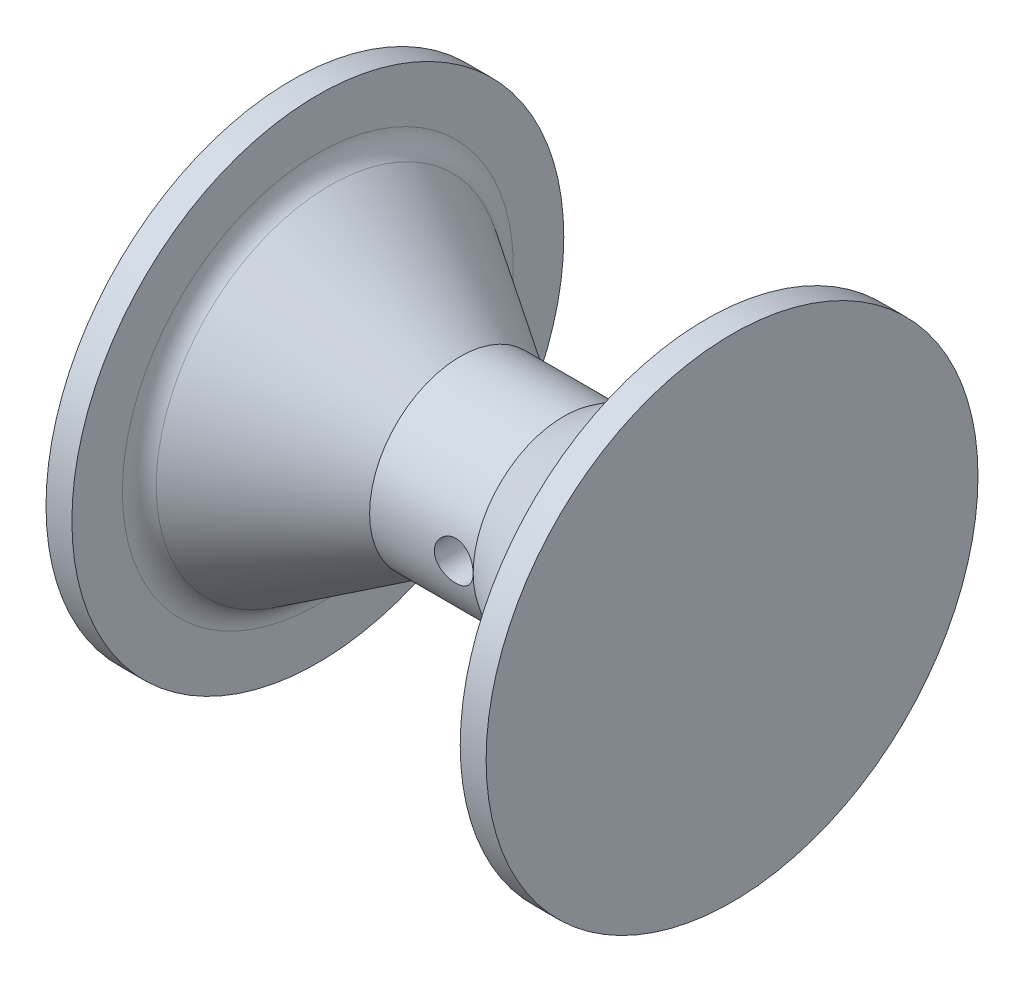
ISO-10303-21;
HEADER;
FILE_DESCRIPTION(('STEP AP214'),'2;1');
FILE_NAME('part.step','',(''),(''),'','','');
FILE_SCHEMA(('AUTOMOTIVE_DESIGN { 1 0 10303 214 1 1 1 1 }'));
ENDSEC;
DATA;
#1=APPLICATION_CONTEXT('core data for automotive mechanical design processes');
#2=APPLICATION_PROTOCOL_DEFINITION('international standard','automotive_design',2000,#1);
#3=PRODUCT_CONTEXT('',#1,'mechanical');
#4=PRODUCT('Part','Part','',(#3));
#5=PRODUCT_RELATED_PRODUCT_CATEGORY('part','',(#4));
#6=PRODUCT_DEFINITION_FORMATION('','',#4);
#7=PRODUCT_DEFINITION_CONTEXT('part definition',#1,'design');
#8=PRODUCT_DEFINITION('design','',#6,#7);
#9=PRODUCT_DEFINITION_SHAPE('','',#8);
#10=(LENGTH_UNIT() NAMED_UNIT(*) SI_UNIT(.MILLI.,.METRE.));
#11=(NAMED_UNIT(*) PLANE_ANGLE_UNIT() SI_UNIT($,.RADIAN.));
#12=(NAMED_UNIT(*) SI_UNIT($,.STERADIAN.) SOLID_ANGLE_UNIT());
#13=UNCERTAINTY_MEASURE_WITH_UNIT(LENGTH_MEASURE(1.E-05),#10,'distance_accuracy_value','');
#14=(GEOMETRIC_REPRESENTATION_CONTEXT(3) GLOBAL_UNCERTAINTY_ASSIGNED_CONTEXT((#13)) GLOBAL_UNIT_ASSIGNED_CONTEXT((#10,
#11,#12)) REPRESENTATION_CONTEXT('',''));
#15=CARTESIAN_POINT('',(0.,0.,0.));
#16=DIRECTION('',(0.,0.,1.));
#17=DIRECTION('',(1.,0.,0.));
#18=AXIS2_PLACEMENT_3D('',#15,#16,#17);
#19=CARTESIAN_POINT('',(-4.,0.,0.));
#20=DIRECTION('',(-1.,0.,0.));
#21=DIRECTION('',(0.,0.,1.));
#22=AXIS2_PLACEMENT_3D('',#19,#20,#21);
#23=CONICAL_SURFACE('',#22,7.,0.566729217523506);
#24=CARTESIAN_POINT('',(-14.0737509843863,0.,0.));
#25=DIRECTION('',(-1.,0.,0.));
#26=DIRECTION('',(0.,0.,1.));
#27=AXIS2_PLACEMENT_3D('',#24,#25,#26);
#28=CIRCLE('',#27,13.4105688082458);
#29=CARTESIAN_POINT('',(-14.0737509843863,0.,13.4105688082458));
#30=VERTEX_POINT('',#29);
#31=EDGE_CURVE('E133',#30,#30,#28,.F.);
#32=ORIENTED_EDGE('',*,*,#31,.T.);
#33=EDGE_LOOP('',(#32));
#34=FACE_BOUND('',#33,.T.);
#35=CARTESIAN_POINT('',(-4.,0.,0.));
#36=DIRECTION('',(-1.,0.,0.));
#37=DIRECTION('',(0.,0.,1.));
#38=AXIS2_PLACEMENT_3D('',#35,#36,#37);
#39=CIRCLE('',#38,7.);
#40=CARTESIAN_POINT('',(-4.,0.,7.));
#41=VERTEX_POINT('',#40);
#42=EDGE_CURVE('E125',#41,#41,#39,.T.);
#43=ORIENTED_EDGE('',*,*,#42,.T.);
#44=EDGE_LOOP('',(#43));
#45=FACE_BOUND('',#44,.T.);
#46=ADVANCED_FACE('F39',(#34,#45),#23,.T.);
#47=CARTESIAN_POINT('',(0.,0.,0.));
#48=DIRECTION('',(-1.,0.,0.));
#49=DIRECTION('',(0.,0.,1.));
#50=AXIS2_PLACEMENT_3D('',#47,#48,#49);
#51=CYLINDRICAL_SURFACE('',#50,7.);
#52=ORIENTED_EDGE('',*,*,#42,.F.);
#53=EDGE_LOOP('',(#52));
#54=FACE_BOUND('',#53,.T.);
#55=CARTESIAN_POINT('',(4.,0.,0.));
#56=DIRECTION('',(-1.,0.,0.));
#57=DIRECTION('',(0.,0.,1.));
#58=AXIS2_PLACEMENT_3D('',#55,#56,#57);
#59=CIRCLE('',#58,7.);
#60=CARTESIAN_POINT('',(4.,0.,-7.));
#61=VERTEX_POINT('',#60);
#62=CARTESIAN_POINT('',(4.,0.,7.));
#63=VERTEX_POINT('',#62);
#64=EDGE_CURVE('E120',#61,#63,#59,.T.);
#65=ORIENTED_EDGE('',*,*,#64,.T.);
#66=CARTESIAN_POINT('',(4.,0.,7.));
#67=CARTESIAN_POINT('',(3.9999971004257,-0.0832358860906166,6.99999846043226));
#68=CARTESIAN_POINT('',(3.99304839161214,-0.166507195600275,6.9985002594971));
#69=CARTESIAN_POINT('',(3.96546434314641,-0.330687344293327,6.99266829827728));
#70=CARTESIAN_POINT('',(3.94481895580507,-0.41159440357119,6.98833245637099));
#71=CARTESIAN_POINT('',(3.89051563539196,-0.568649323817737,6.97730831788827));
#72=CARTESIAN_POINT('',(3.85687102061868,-0.644801963446555,6.97062242967171));
#73=CARTESIAN_POINT('',(3.77756591382874,-0.790378177960787,6.95562106817971));
#74=CARTESIAN_POINT('',(3.73190583075006,-0.859801981747369,6.94730565036661));
#75=CARTESIAN_POINT('',(3.62911970032649,-0.99102479053523,6.92981369246311));
#76=CARTESIAN_POINT('',(3.57184377810147,-1.05270503419445,6.92062683143259));
#77=CARTESIAN_POINT('',(3.4477736843148,-1.16566042389435,6.90250069814144));
#78=CARTESIAN_POINT('',(3.38097869174874,-1.21693467150908,6.8935614473163));
#79=CARTESIAN_POINT('',(3.23889424713957,-1.30814204379809,6.87684116047225));
#80=CARTESIAN_POINT('',(3.16352248224379,-1.34794958335009,6.8690733634436));
#81=CARTESIAN_POINT('',(3.00696554623316,-1.41428823691148,6.85572325558537));
#82=CARTESIAN_POINT('',(2.92578104150743,-1.44082087001716,6.85014069470711));
#83=CARTESIAN_POINT('',(2.76118891341193,-1.47946574422454,6.84189808926311));
#84=CARTESIAN_POINT('',(2.67783272433614,-1.49178779748342,6.83919556896486));
#85=CARTESIAN_POINT('',(2.51019576749301,-1.50231395206577,6.83689139845106));
#86=CARTESIAN_POINT('',(2.42591510982005,-1.50051971664629,6.83728938291729));
#87=CARTESIAN_POINT('',(2.26037531206621,-1.48303326340861,6.84110276603832));
#88=CARTESIAN_POINT('',(2.17908911089985,-1.46758398649408,6.84446541682162));
#89=CARTESIAN_POINT('',(2.02028975971066,-1.42361054298677,6.85374593375788));
#90=CARTESIAN_POINT('',(1.94277681396768,-1.39508566936466,6.85966393808402));
#91=CARTESIAN_POINT('',(1.79303712712666,-1.32554551075991,6.87344080755724));
#92=CARTESIAN_POINT('',(1.72085548728745,-1.2844361097283,6.88131420983365));
#93=CARTESIAN_POINT('',(1.58432483504204,-1.19096007283993,6.89810572501288));
#94=CARTESIAN_POINT('',(1.5199768513138,-1.13859196103562,6.90702397481896));
#95=CARTESIAN_POINT('',(1.3995406443266,-1.0227954275532,6.92512718393878));
#96=CARTESIAN_POINT('',(1.34365129341526,-0.95916023396441,6.93431383972178));
#97=CARTESIAN_POINT('',(1.24330626631034,-0.823317306269096,6.95175017497059));
#98=CARTESIAN_POINT('',(1.19885078139961,-0.7511094287754,6.95999983875972));
#99=CARTESIAN_POINT('',(1.12258932009307,-0.599933462049959,6.97465778534003));
#100=CARTESIAN_POINT('',(1.09080858742202,-0.520952258863483,6.98106238643354));
#101=CARTESIAN_POINT('',(1.04102435167891,-0.358603146685707,6.99128109245334));
#102=CARTESIAN_POINT('',(1.02301892743668,-0.275235851133669,6.99509555860384));
#103=CARTESIAN_POINT('',(1.00158378585658,-0.108187670836629,6.99965306347808));
#104=CARTESIAN_POINT('',(0.99788228711822,-0.0245431772716144,7.00045336521066));
#105=CARTESIAN_POINT('',(1.00442457112516,0.142168973650405,6.99905248935969));
#106=CARTESIAN_POINT('',(1.01466744796294,0.225236668127255,6.99685150675698));
#107=CARTESIAN_POINT('',(1.0485822436617,0.387542537982806,6.98973143045266));
#108=CARTESIAN_POINT('',(1.07211236947253,0.466811712908477,6.9848410504546));
#109=CARTESIAN_POINT('',(1.13177694299482,0.620278450473418,6.9728892442151));
#110=CARTESIAN_POINT('',(1.16791243431165,0.69447559258774,6.96582763822237));
#111=CARTESIAN_POINT('',(1.25233354306033,0.836821397964754,6.950175043904));
#112=CARTESIAN_POINT('',(1.30077979490973,0.90487257511114,6.94156431354275));
#113=CARTESIAN_POINT('',(1.40823482488874,1.0319769255236,6.92381033034847));
#114=CARTESIAN_POINT('',(1.46724491588744,1.091028978692,6.91466701142097));
#115=CARTESIAN_POINT('',(1.59539737018714,1.19952711057989,6.89668172706324));
#116=CARTESIAN_POINT('',(1.6647000992221,1.24878537255157,6.88784792221285));
#117=CARTESIAN_POINT('',(1.81075459647799,1.3349641538604,6.87166654559681));
#118=CARTESIAN_POINT('',(1.88750604697749,1.37188519913706,6.86431891048055));
#119=CARTESIAN_POINT('',(2.0458722989946,1.43209741248548,6.8520100980739));
#120=CARTESIAN_POINT('',(2.12745735643067,1.45546398641275,6.84703574582967));
#121=CARTESIAN_POINT('',(2.29351558383364,1.48812696085335,6.84001186708418));
#122=CARTESIAN_POINT('',(2.37798831120132,1.49742550780258,6.83796189439706));
#123=CARTESIAN_POINT('',(2.54553234317524,1.5015999992604,6.83704618848155));
#124=CARTESIAN_POINT('',(2.62859601498058,1.49677347258311,6.83811476518543));
#125=CARTESIAN_POINT('',(2.79269724213259,1.47349789406331,6.8431676318483));
#126=CARTESIAN_POINT('',(2.87373481938657,1.45504898957979,6.84715189026714));
#127=CARTESIAN_POINT('',(3.03125865786917,1.40519345940434,6.85755581104157));
#128=CARTESIAN_POINT('',(3.10775864866429,1.37382847170887,6.86396764224703));
#129=CARTESIAN_POINT('',(3.25445537250685,1.29906751595601,6.87850764590649));
#130=CARTESIAN_POINT('',(3.32465147861504,1.255670353015,6.88663598880363));
#131=CARTESIAN_POINT('',(3.45821819372537,1.15708290349304,6.90389055593232));
#132=CARTESIAN_POINT('',(3.52142969594698,1.10167987421237,6.91303309938926));
#133=CARTESIAN_POINT('',(3.63775626252046,0.981086554619621,6.93117449799694));
#134=CARTESIAN_POINT('',(3.69086899431221,0.915894009385597,6.94017331951296));
#135=CARTESIAN_POINT('',(3.78611595950556,0.776603147268717,6.95714491048987));
#136=CARTESIAN_POINT('',(3.82810660623098,0.702404846009642,6.96510364570626));
#137=CARTESIAN_POINT('',(3.89895452890618,0.547850160940599,6.97895826104019));
#138=CARTESIAN_POINT('',(3.92782302258504,0.46749910586388,6.98485590212343));
#139=CARTESIAN_POINT('',(3.96635218513115,0.322535217553204,6.99284848461772));
#140=CARTESIAN_POINT('',(3.97894643398003,0.258717205545979,6.99551391888263));
#141=CARTESIAN_POINT('',(3.99577130171167,0.129939960853846,6.99909024154719));
#142=CARTESIAN_POINT('',(4.00000226364606,0.0649807750887447,7.00000120191314));
#143=CARTESIAN_POINT('',(4.,0.,7.));
#144=B_SPLINE_CURVE_WITH_KNOTS('',3,(#66,#67,#68,#69,#70,#71,#72,#73,#74,#75,#76,#77,#78,#79,
#80,#81,#82,#83,#84,#85,#86,#87,#88,#89,#90,#91,#92,#93,#94,#95,#96,#97,#98,#99,#100,#101,#102,
#103,#104,#105,#106,#107,#108,#109,#110,#111,#112,#113,#114,#115,#116,#117,#118,#119,#120,#121,
#122,#123,#124,#125,#126,#127,#128,#129,#130,#131,#132,#133,#134,#135,#136,#137,#138,#139,#140,
#141,#142,#143),.UNSPECIFIED.,.T.,.F.,(4,2,2,2,2,2,2,2,2,2,2,2,2,2,2,2,2,2,2,2,2,2,2,2,2,2,2,2,
2,2,2,2,2,2,2,2,2,2,4),(0.,0.249469836512082,0.499122883219936,0.748520824425602,
0.997910278645886,1.25074961881732,1.50361077918506,1.7591442921451,2.0146485567749,
2.26633008124666,2.51798195169165,2.76524475452928,3.01252092904568,3.26169356165968,
3.51089887920889,3.76527011050291,4.0196455970235,4.27452521139806,4.52936927256343,
4.77934665704185,5.02930780231429,5.27665060589267,5.52401389198434,5.77478733867803,
6.02559197304485,6.28082063283534,6.53603841075806,6.78982240408475,7.04356767229185,
7.29200680540294,7.5404432510827,7.78808499706785,8.03575134451623,8.28822950154114,
8.54076590397115,8.79641910357222,9.05185334010271,9.24661799132294,9.44137465337336),.UNSPECIFIED.);
#145=EDGE_CURVE('E58',#63,#63,#144,.T.);
#146=ORIENTED_EDGE('',*,*,#145,.T.);
#147=EDGE_CURVE('E121',#63,#61,#59,.T.);
#148=ORIENTED_EDGE('',*,*,#147,.T.);
#149=CARTESIAN_POINT('',(4.,0.,-7.));
#150=CARTESIAN_POINT('',(3.9999971004257,0.0832358860906166,-6.99999846043226));
#151=CARTESIAN_POINT('',(3.99304839161214,0.166507195600275,-6.9985002594971));
#152=CARTESIAN_POINT('',(3.96546434314641,0.330687344293327,-6.99266829827728));
#153=CARTESIAN_POINT('',(3.94481895580507,0.41159440357119,-6.98833245637099));
#154=CARTESIAN_POINT('',(3.89051563539196,0.568649323817737,-6.97730831788827));
#155=CARTESIAN_POINT('',(3.85687102061868,0.644801963446555,-6.97062242967171));
#156=CARTESIAN_POINT('',(3.77756591382874,0.790378177960787,-6.95562106817971));
#157=CARTESIAN_POINT('',(3.73190583075006,0.859801981747369,-6.94730565036661));
#158=CARTESIAN_POINT('',(3.62911970032649,0.99102479053523,-6.92981369246311));
#159=CARTESIAN_POINT('',(3.57184377810147,1.05270503419445,-6.92062683143259));
#160=CARTESIAN_POINT('',(3.4477736843148,1.16566042389435,-6.90250069814144));
#161=CARTESIAN_POINT('',(3.38097869174874,1.21693467150908,-6.8935614473163));
#162=CARTESIAN_POINT('',(3.23889424713957,1.30814204379809,-6.87684116047225));
#163=CARTESIAN_POINT('',(3.16352248224379,1.34794958335009,-6.8690733634436));
#164=CARTESIAN_POINT('',(3.00696554623316,1.41428823691148,-6.85572325558537));
#165=CARTESIAN_POINT('',(2.92578104150743,1.44082087001716,-6.85014069470711));
#166=CARTESIAN_POINT('',(2.76118891341193,1.47946574422454,-6.84189808926311));
#167=CARTESIAN_POINT('',(2.67783272433614,1.49178779748342,-6.83919556896486));
#168=CARTESIAN_POINT('',(2.51019576749301,1.50231395206577,-6.83689139845106));
#169=CARTESIAN_POINT('',(2.42591510982005,1.50051971664629,-6.83728938291729));
#170=CARTESIAN_POINT('',(2.26037531206621,1.48303326340861,-6.84110276603832));
#171=CARTESIAN_POINT('',(2.17908911089985,1.46758398649408,-6.84446541682162));
#172=CARTESIAN_POINT('',(2.02028975971066,1.42361054298677,-6.85374593375788));
#173=CARTESIAN_POINT('',(1.94277681396768,1.39508566936466,-6.85966393808402));
#174=CARTESIAN_POINT('',(1.79303712712666,1.32554551075991,-6.87344080755724));
#175=CARTESIAN_POINT('',(1.72085548728745,1.2844361097283,-6.88131420983365));
#176=CARTESIAN_POINT('',(1.58432483504204,1.19096007283993,-6.89810572501288));
#177=CARTESIAN_POINT('',(1.5199768513138,1.13859196103562,-6.90702397481896));
#178=CARTESIAN_POINT('',(1.3995406443266,1.0227954275532,-6.92512718393878));
#179=CARTESIAN_POINT('',(1.34365129341526,0.95916023396441,-6.93431383972178));
#180=CARTESIAN_POINT('',(1.24330626631034,0.823317306269096,-6.95175017497059));
#181=CARTESIAN_POINT('',(1.19885078139961,0.7511094287754,-6.95999983875972));
#182=CARTESIAN_POINT('',(1.12258932009307,0.599933462049959,-6.97465778534003));
#183=CARTESIAN_POINT('',(1.09080858742202,0.520952258863483,-6.98106238643354));
#184=CARTESIAN_POINT('',(1.04102435167891,0.358603146685707,-6.99128109245334));
#185=CARTESIAN_POINT('',(1.02301892743668,0.275235851133669,-6.99509555860384));
#186=CARTESIAN_POINT('',(1.00158378585658,0.108187670836629,-6.99965306347808));
#187=CARTESIAN_POINT('',(0.99788228711822,0.0245431772716144,-7.00045336521066));
#188=CARTESIAN_POINT('',(1.00442457112516,-0.142168973650405,-6.99905248935969));
#189=CARTESIAN_POINT('',(1.01466744796294,-0.225236668127255,-6.99685150675698));
#190=CARTESIAN_POINT('',(1.0485822436617,-0.387542537982806,-6.98973143045266));
#191=CARTESIAN_POINT('',(1.07211236947253,-0.466811712908477,-6.9848410504546));
#192=CARTESIAN_POINT('',(1.13177694299482,-0.620278450473418,-6.9728892442151));
#193=CARTESIAN_POINT('',(1.16791243431165,-0.69447559258774,-6.96582763822237));
#194=CARTESIAN_POINT('',(1.25233354306033,-0.836821397964754,-6.950175043904));
#195=CARTESIAN_POINT('',(1.30077979490973,-0.90487257511114,-6.94156431354275));
#196=CARTESIAN_POINT('',(1.40823482488874,-1.0319769255236,-6.92381033034847));
#197=CARTESIAN_POINT('',(1.46724491588744,-1.091028978692,-6.91466701142097));
#198=CARTESIAN_POINT('',(1.59539737018714,-1.19952711057989,-6.89668172706324));
#199=CARTESIAN_POINT('',(1.6647000992221,-1.24878537255157,-6.88784792221285));
#200=CARTESIAN_POINT('',(1.81075459647799,-1.3349641538604,-6.87166654559681));
#201=CARTESIAN_POINT('',(1.88750604697749,-1.37188519913706,-6.86431891048055));
#202=CARTESIAN_POINT('',(2.0458722989946,-1.43209741248548,-6.8520100980739));
#203=CARTESIAN_POINT('',(2.12745735643067,-1.45546398641275,-6.84703574582967));
#204=CARTESIAN_POINT('',(2.29351558383364,-1.48812696085335,-6.84001186708418));
#205=CARTESIAN_POINT('',(2.37798831120132,-1.49742550780258,-6.83796189439706));
#206=CARTESIAN_POINT('',(2.54553234317524,-1.5015999992604,-6.83704618848155));
#207=CARTESIAN_POINT('',(2.62859601498058,-1.49677347258311,-6.83811476518543));
#208=CARTESIAN_POINT('',(2.79269724213259,-1.47349789406331,-6.8431676318483));
#209=CARTESIAN_POINT('',(2.87373481938657,-1.45504898957979,-6.84715189026714));
#210=CARTESIAN_POINT('',(3.03125865786917,-1.40519345940434,-6.85755581104157));
#211=CARTESIAN_POINT('',(3.10775864866429,-1.37382847170887,-6.86396764224703));
#212=CARTESIAN_POINT('',(3.25445537250685,-1.29906751595601,-6.87850764590649));
#213=CARTESIAN_POINT('',(3.32465147861504,-1.255670353015,-6.88663598880363));
#214=CARTESIAN_POINT('',(3.45821819372537,-1.15708290349304,-6.90389055593232));
#215=CARTESIAN_POINT('',(3.52142969594698,-1.10167987421237,-6.91303309938926));
#216=CARTESIAN_POINT('',(3.63775626252046,-0.981086554619621,-6.93117449799694));
#217=CARTESIAN_POINT('',(3.69086899431221,-0.915894009385597,-6.94017331951296));
#218=CARTESIAN_POINT('',(3.78611595950556,-0.776603147268717,-6.95714491048987));
#219=CARTESIAN_POINT('',(3.82810660623098,-0.702404846009642,-6.96510364570626));
#220=CARTESIAN_POINT('',(3.89895452890618,-0.547850160940599,-6.97895826104019));
#221=CARTESIAN_POINT('',(3.92782302258504,-0.46749910586388,-6.98485590212343));
#222=CARTESIAN_POINT('',(3.96635218513115,-0.322535217553204,-6.99284848461772));
#223=CARTESIAN_POINT('',(3.97894643398003,-0.258717205545979,-6.99551391888263));
#224=CARTESIAN_POINT('',(3.99577130171167,-0.129939960853846,-6.99909024154719));
#225=CARTESIAN_POINT('',(4.00000226364606,-0.0649807750887447,-7.00000120191314));
#226=CARTESIAN_POINT('',(4.,0.,-7.));
#227=B_SPLINE_CURVE_WITH_KNOTS('',3,(#149,#150,#151,#152,#153,#154,#155,#156,#157,#158,#159,
#160,#161,#162,#163,#164,#165,#166,#167,#168,#169,#170,#171,#172,#173,#174,#175,#176,#177,#178,
#179,#180,#181,#182,#183,#184,#185,#186,#187,#188,#189,#190,#191,#192,#193,#194,#195,#196,#197,
#198,#199,#200,#201,#202,#203,#204,#205,#206,#207,#208,#209,#210,#211,#212,#213,#214,#215,#216,
#217,#218,#219,#220,#221,#222,#223,#224,#225,#226),.UNSPECIFIED.,.T.,.F.,(4,2,2,2,2,2,2,2,2,2,2,
2,2,2,2,2,2,2,2,2,2,2,2,2,2,2,2,2,2,2,2,2,2,2,2,2,2,2,4),(0.,0.249469836512082,
0.499122883219936,0.748520824425602,0.997910278645886,1.25074961881732,1.50361077918506,
1.7591442921451,2.0146485567749,2.26633008124666,2.51798195169165,2.76524475452928,
3.01252092904568,3.26169356165968,3.51089887920889,3.76527011050291,4.0196455970235,
4.27452521139806,4.52936927256343,4.77934665704185,5.02930780231429,5.27665060589267,
5.52401389198434,5.77478733867803,6.02559197304485,6.28082063283534,6.53603841075806,
6.78982240408475,7.04356767229185,7.29200680540294,7.5404432510827,7.78808499706785,
8.03575134451623,8.28822950154114,8.54076590397115,8.79641910357222,9.05185334010271,
9.24661799132294,9.44137465337336),.UNSPECIFIED.);
#228=EDGE_CURVE('E53',#61,#61,#227,.T.);
#229=ORIENTED_EDGE('',*,*,#228,.T.);
#230=EDGE_LOOP('',(#65,#146,#148,#229));
#231=FACE_BOUND('',#230,.T.);
#232=ADVANCED_FACE('F153',(#54,#231),#51,.T.);
#233=CARTESIAN_POINT('',(15.,0.,0.));
#234=DIRECTION('',(1.,0.,0.));
#235=DIRECTION('',(0.,0.,-1.));
#236=AXIS2_PLACEMENT_3D('',#233,#234,#235);
#237=CONICAL_SURFACE('',#236,14.,0.566729217523506);
#238=CARTESIAN_POINT('',(14.0737509843863,0.,0.));
#239=DIRECTION('',(1.,0.,0.));
#240=DIRECTION('',(0.,0.,-1.));
#241=AXIS2_PLACEMENT_3D('',#238,#239,#240);
#242=CIRCLE('',#241,13.4105688082458);
#243=CARTESIAN_POINT('',(14.0737509843863,0.,-13.4105688082458));
#244=VERTEX_POINT('',#243);
#245=EDGE_CURVE('E48',#244,#244,#242,.F.);
#246=ORIENTED_EDGE('',*,*,#245,.T.);
#247=EDGE_LOOP('',(#246));
#248=FACE_BOUND('',#247,.T.);
#249=ORIENTED_EDGE('',*,*,#147,.F.);
#250=ORIENTED_EDGE('',*,*,#64,.F.);
#251=EDGE_LOOP('',(#249,#250));
#252=FACE_BOUND('',#251,.T.);
#253=ADVANCED_FACE('F140',(#248,#252),#237,.T.);
#254=CARTESIAN_POINT('',(15.,14.,0.));
#255=DIRECTION('',(1.,0.,0.));
#256=DIRECTION('',(0.,0.,-1.));
#257=AXIS2_PLACEMENT_3D('',#254,#255,#256);
#258=PLANE('',#257);
#259=CARTESIAN_POINT('',(15.,0.,0.));
#260=DIRECTION('',(1.,0.,0.));
#261=DIRECTION('',(0.,0.,-1.));
#262=AXIS2_PLACEMENT_3D('',#259,#260,#261);
#263=CIRCLE('',#262,15.0978917837101);
#264=CARTESIAN_POINT('',(15.,0.,-15.0978917837101));
#265=VERTEX_POINT('',#264);
#266=EDGE_CURVE('E11',#265,#265,#263,.T.);
#267=ORIENTED_EDGE('',*,*,#266,.T.);
#268=EDGE_LOOP('',(#267));
#269=FACE_BOUND('',#268,.T.);
#270=CARTESIAN_POINT('',(15.,0.,0.));
#271=DIRECTION('',(-1.,0.,0.));
#272=DIRECTION('',(0.,0.,1.));
#273=AXIS2_PLACEMENT_3D('',#270,#271,#272);
#274=CIRCLE('',#273,19.);
#275=CARTESIAN_POINT('',(15.,0.,19.));
#276=VERTEX_POINT('',#275);
#277=EDGE_CURVE('E116',#276,#276,#274,.T.);
#278=ORIENTED_EDGE('',*,*,#277,.T.);
#279=EDGE_LOOP('',(#278));
#280=FACE_BOUND('',#279,.T.);
#281=ADVANCED_FACE('F203',(#269,#280),#258,.F.);
#282=CARTESIAN_POINT('',(0.,0.,0.));
#283=DIRECTION('',(-1.,0.,0.));
#284=DIRECTION('',(0.,0.,1.));
#285=AXIS2_PLACEMENT_3D('',#282,#283,#284);
#286=CYLINDRICAL_SURFACE('',#285,19.);
#287=ORIENTED_EDGE('',*,*,#277,.F.);
#288=EDGE_LOOP('',(#287));
#289=FACE_BOUND('',#288,.T.);
#290=CARTESIAN_POINT('',(17.,0.,0.));
#291=DIRECTION('',(-1.,0.,0.));
#292=DIRECTION('',(0.,0.,1.));
#293=AXIS2_PLACEMENT_3D('',#290,#291,#292);
#294=CIRCLE('',#293,19.);
#295=CARTESIAN_POINT('',(17.,0.,19.));
#296=VERTEX_POINT('',#295);
#297=EDGE_CURVE('E112',#296,#296,#294,.T.);
#298=ORIENTED_EDGE('',*,*,#297,.T.);
#299=EDGE_LOOP('',(#298));
#300=FACE_BOUND('',#299,.T.);
#301=ADVANCED_FACE('F200',(#289,#300),#286,.T.);
#302=CARTESIAN_POINT('',(17.,19.,0.));
#303=DIRECTION('',(-1.,0.,0.));
#304=DIRECTION('',(0.,0.,1.));
#305=AXIS2_PLACEMENT_3D('',#302,#303,#304);
#306=PLANE('',#305);
#307=ORIENTED_EDGE('',*,*,#297,.F.);
#308=EDGE_LOOP('',(#307));
#309=FACE_BOUND('',#308,.T.);
#310=ADVANCED_FACE('F196',(#309),#306,.F.);
#311=CARTESIAN_POINT('',(-17.,19.,0.));
#312=DIRECTION('',(1.,0.,0.));
#313=DIRECTION('',(0.,0.,-1.));
#314=AXIS2_PLACEMENT_3D('',#311,#312,#313);
#315=PLANE('',#314);
#316=DIRECTION('',(0.,1.,0.));
#317=VECTOR('',#316,1.);
#318=CARTESIAN_POINT('',(-17.,1.57480157480236,2.9));
#319=LINE('',#318,#317);
#320=CARTESIAN_POINT('',(-17.,-1.57480157480236,2.9));
#321=VERTEX_POINT('',#320);
#322=CARTESIAN_POINT('',(-17.,1.57480157480236,2.9));
#323=VERTEX_POINT('',#322);
#324=EDGE_CURVE('E91',#321,#323,#319,.T.);
#325=ORIENTED_EDGE('',*,*,#324,.F.);
#326=CARTESIAN_POINT('',(-17.,0.,0.));
#327=DIRECTION('',(-1.,0.,0.));
#328=DIRECTION('',(0.,0.,1.));
#329=AXIS2_PLACEMENT_3D('',#326,#327,#328);
#330=CIRCLE('',#329,3.3);
#331=EDGE_CURVE('E79',#323,#321,#330,.T.);
#332=ORIENTED_EDGE('',*,*,#331,.F.);
#333=EDGE_LOOP('',(#325,#332));
#334=FACE_BOUND('',#333,.T.);
#335=CARTESIAN_POINT('',(-17.,0.,0.));
#336=DIRECTION('',(-1.,0.,0.));
#337=DIRECTION('',(0.,0.,1.));
#338=AXIS2_PLACEMENT_3D('',#335,#336,#337);
#339=CIRCLE('',#338,19.);
#340=CARTESIAN_POINT('',(-17.,0.,19.));
#341=VERTEX_POINT('',#340);
#342=EDGE_CURVE('E108',#341,#341,#339,.T.);
#343=ORIENTED_EDGE('',*,*,#342,.T.);
#344=EDGE_LOOP('',(#343));
#345=FACE_BOUND('',#344,.T.);
#346=ADVANCED_FACE('F192',(#334,#345),#315,.F.);
#347=CARTESIAN_POINT('',(0.,0.,0.));
#348=DIRECTION('',(-1.,0.,0.));
#349=DIRECTION('',(0.,0.,1.));
#350=AXIS2_PLACEMENT_3D('',#347,#348,#349);
#351=CYLINDRICAL_SURFACE('',#350,19.);
#352=ORIENTED_EDGE('',*,*,#342,.F.);
#353=EDGE_LOOP('',(#352));
#354=FACE_BOUND('',#353,.T.);
#355=CARTESIAN_POINT('',(-15.,0.,0.));
#356=DIRECTION('',(-1.,0.,0.));
#357=DIRECTION('',(0.,0.,1.));
#358=AXIS2_PLACEMENT_3D('',#355,#356,#357);
#359=CIRCLE('',#358,19.);
#360=CARTESIAN_POINT('',(-15.,0.,19.));
#361=VERTEX_POINT('',#360);
#362=EDGE_CURVE('E103',#361,#361,#359,.T.);
#363=ORIENTED_EDGE('',*,*,#362,.T.);
#364=EDGE_LOOP('',(#363));
#365=FACE_BOUND('',#364,.T.);
#366=ADVANCED_FACE('F188',(#354,#365),#351,.T.);
#367=CARTESIAN_POINT('',(-15.,14.,0.));
#368=DIRECTION('',(-1.,0.,0.));
#369=DIRECTION('',(0.,0.,1.));
#370=AXIS2_PLACEMENT_3D('',#367,#368,#369);
#371=PLANE('',#370);
#372=CARTESIAN_POINT('',(-15.,0.,0.));
#373=DIRECTION('',(-1.,0.,0.));
#374=DIRECTION('',(0.,0.,1.));
#375=AXIS2_PLACEMENT_3D('',#372,#373,#374);
#376=CIRCLE('',#375,15.0978917837101);
#377=CARTESIAN_POINT('',(-15.,0.,15.0978917837101));
#378=VERTEX_POINT('',#377);
#379=EDGE_CURVE('E129',#378,#378,#376,.T.);
#380=ORIENTED_EDGE('',*,*,#379,.T.);
#381=EDGE_LOOP('',(#380));
#382=FACE_BOUND('',#381,.T.);
#383=ORIENTED_EDGE('',*,*,#362,.F.);
#384=EDGE_LOOP('',(#383));
#385=FACE_BOUND('',#384,.T.);
#386=ADVANCED_FACE('F185',(#382,#385),#371,.F.);
#387=CARTESIAN_POINT('',(-4.,0.,0.));
#388=DIRECTION('',(-1.,0.,0.));
#389=DIRECTION('',(0.,0.,1.));
#390=AXIS2_PLACEMENT_3D('',#387,#388,#389);
#391=CYLINDRICAL_SURFACE('',#390,3.3);
#392=ORIENTED_EDGE('',*,*,#331,.T.);
#393=DIRECTION('',(-1.,0.,0.));
#394=VECTOR('',#393,1.);
#395=CARTESIAN_POINT('',(-4.,-1.57480157480236,2.9));
#396=LINE('',#395,#394);
#397=CARTESIAN_POINT('',(-4.,-1.57480157480236,2.9));
#398=VERTEX_POINT('',#397);
#399=EDGE_CURVE('E73',#398,#321,#396,.T.);
#400=ORIENTED_EDGE('',*,*,#399,.F.);
#401=CARTESIAN_POINT('',(-4.,0.,0.));
#402=DIRECTION('',(-1.,0.,0.));
#403=DIRECTION('',(0.,0.,1.));
#404=AXIS2_PLACEMENT_3D('',#401,#402,#403);
#405=CIRCLE('',#404,3.3);
#406=CARTESIAN_POINT('',(-4.,1.57480157480236,2.9));
#407=VERTEX_POINT('',#406);
#408=EDGE_CURVE('E76',#407,#398,#405,.T.);
#409=ORIENTED_EDGE('',*,*,#408,.F.);
#410=DIRECTION('',(-1.,0.,0.));
#411=VECTOR('',#410,1.);
#412=CARTESIAN_POINT('',(-4.,1.57480157480236,2.9));
#413=LINE('',#412,#411);
#414=EDGE_CURVE('E85',#407,#323,#413,.T.);
#415=ORIENTED_EDGE('',*,*,#414,.T.);
#416=EDGE_LOOP('',(#392,#400,#409,#415));
#417=FACE_BOUND('',#416,.T.);
#418=ADVANCED_FACE('F75',(#417),#391,.F.);
#419=CARTESIAN_POINT('',(-4.,1.57480157480236,2.9));
#420=DIRECTION('',(0.,0.,1.));
#421=DIRECTION('',(1.,0.,0.));
#422=AXIS2_PLACEMENT_3D('',#419,#420,#421);
#423=PLANE('',#422);
#424=ORIENTED_EDGE('',*,*,#324,.T.);
#425=ORIENTED_EDGE('',*,*,#414,.F.);
#426=DIRECTION('',(0.,1.,0.));
#427=VECTOR('',#426,1.);
#428=CARTESIAN_POINT('',(-4.,1.57480157480236,2.9));
#429=LINE('',#428,#427);
#430=EDGE_CURVE('E86',#398,#407,#429,.T.);
#431=ORIENTED_EDGE('',*,*,#430,.F.);
#432=ORIENTED_EDGE('',*,*,#399,.T.);
#433=EDGE_LOOP('',(#424,#425,#431,#432));
#434=FACE_BOUND('',#433,.T.);
#435=ADVANCED_FACE('F93',(#434),#423,.F.);
#436=CARTESIAN_POINT('',(-4.,0.,0.));
#437=DIRECTION('',(-1.,0.,0.));
#438=DIRECTION('',(0.,0.,1.));
#439=AXIS2_PLACEMENT_3D('',#436,#437,#438);
#440=PLANE('',#439);
#441=ORIENTED_EDGE('',*,*,#408,.T.);
#442=ORIENTED_EDGE('',*,*,#430,.T.);
#443=EDGE_LOOP('',(#441,#442));
#444=FACE_BOUND('',#443,.T.);
#445=ADVANCED_FACE('F89',(#444),#440,.T.);
#446=CARTESIAN_POINT('',(2.5,0.,-17.5));
#447=DIRECTION('',(0.,0.,1.));
#448=DIRECTION('',(1.,0.,0.));
#449=AXIS2_PLACEMENT_3D('',#446,#447,#448);
#450=CYLINDRICAL_SURFACE('',#449,1.5);
#451=ORIENTED_EDGE('',*,*,#228,.F.);
#452=EDGE_LOOP('',(#451));
#453=FACE_BOUND('',#452,.T.);
#454=ORIENTED_EDGE('',*,*,#145,.F.);
#455=EDGE_LOOP('',(#454));
#456=FACE_BOUND('',#455,.T.);
#457=ADVANCED_FACE('F149',(#453,#456),#450,.F.);
#458=CARTESIAN_POINT('',(-13.,0.,0.));
#459=DIRECTION('',(-1.,0.,0.));
#460=DIRECTION('',(0.,0.,1.));
#461=AXIS2_PLACEMENT_3D('',#458,#459,#460);
#462=TOROIDAL_SURFACE('',#461,15.0978917837101,2.);
#463=ORIENTED_EDGE('',*,*,#31,.F.);
#464=EDGE_LOOP('',(#463));
#465=FACE_BOUND('',#464,.T.);
#466=ORIENTED_EDGE('',*,*,#379,.F.);
#467=EDGE_LOOP('',(#466));
#468=FACE_BOUND('',#467,.T.);
#469=ADVANCED_FACE('F144',(#465,#468),#462,.F.);
#470=CARTESIAN_POINT('',(13.,0.,0.));
#471=DIRECTION('',(1.,0.,0.));
#472=DIRECTION('',(0.,0.,-1.));
#473=AXIS2_PLACEMENT_3D('',#470,#471,#472);
#474=TOROIDAL_SURFACE('',#473,15.0978917837101,2.);
#475=ORIENTED_EDGE('',*,*,#266,.F.);
#476=EDGE_LOOP('',(#475));
#477=FACE_BOUND('',#476,.T.);
#478=ORIENTED_EDGE('',*,*,#245,.F.);
#479=EDGE_LOOP('',(#478));
#480=FACE_BOUND('',#479,.T.);
#481=ADVANCED_FACE('F41',(#477,#480),#474,.F.);
#482=CLOSED_SHELL('',(#46,#232,#253,#281,#301,#310,#346,#366,#386,#418,#435,#445,#457,#469,#481));
#483=MANIFOLD_SOLID_BREP('B2',#482);
#484=ADVANCED_BREP_SHAPE_REPRESENTATION('',(#18,#483),#14);
#485=SHAPE_DEFINITION_REPRESENTATION(#9,#484);
ENDSEC;
END-ISO-10303-21;
